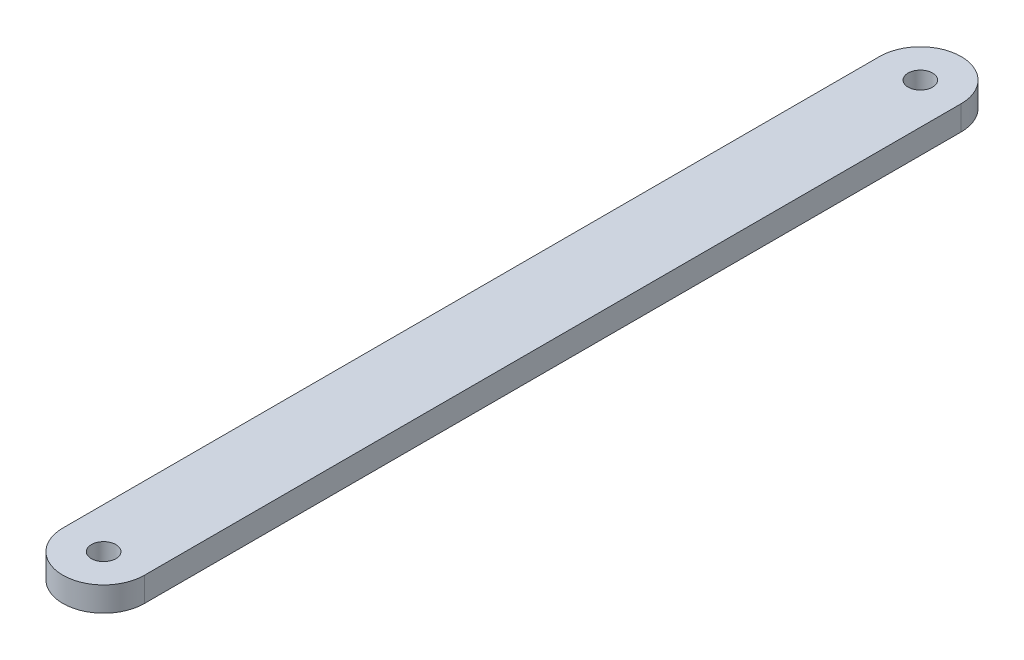
ISO-10303-21;
HEADER;
FILE_DESCRIPTION(('STEP AP214'),'2;1');
FILE_NAME('part.step','',(''),(''),'','','');
FILE_SCHEMA(('AUTOMOTIVE_DESIGN { 1 0 10303 214 1 1 1 1 }'));
ENDSEC;
DATA;
#1=APPLICATION_CONTEXT('core data for automotive mechanical design processes');
#2=APPLICATION_PROTOCOL_DEFINITION('international standard','automotive_design',2000,#1);
#3=PRODUCT_CONTEXT('',#1,'mechanical');
#4=PRODUCT('Part','Part','',(#3));
#5=PRODUCT_RELATED_PRODUCT_CATEGORY('part','',(#4));
#6=PRODUCT_DEFINITION_FORMATION('','',#4);
#7=PRODUCT_DEFINITION_CONTEXT('part definition',#1,'design');
#8=PRODUCT_DEFINITION('design','',#6,#7);
#9=PRODUCT_DEFINITION_SHAPE('','',#8);
#10=(LENGTH_UNIT() NAMED_UNIT(*) SI_UNIT(.MILLI.,.METRE.));
#11=(NAMED_UNIT(*) PLANE_ANGLE_UNIT() SI_UNIT($,.RADIAN.));
#12=(NAMED_UNIT(*) SI_UNIT($,.STERADIAN.) SOLID_ANGLE_UNIT());
#13=UNCERTAINTY_MEASURE_WITH_UNIT(LENGTH_MEASURE(1.E-05),#10,'distance_accuracy_value','');
#14=(GEOMETRIC_REPRESENTATION_CONTEXT(3) GLOBAL_UNCERTAINTY_ASSIGNED_CONTEXT((#13)) GLOBAL_UNIT_ASSIGNED_CONTEXT((#10,
#11,#12)) REPRESENTATION_CONTEXT('',''));
#15=CARTESIAN_POINT('',(0.,0.,0.));
#16=DIRECTION('',(0.,0.,1.));
#17=DIRECTION('',(1.,0.,0.));
#18=AXIS2_PLACEMENT_3D('',#15,#16,#17);
#19=CARTESIAN_POINT('',(-10.,0.499999999999999,-50.));
#20=DIRECTION('',(-1.,0.,0.));
#21=DIRECTION('',(0.,0.,1.));
#22=AXIS2_PLACEMENT_3D('',#19,#20,#21);
#23=PLANE('',#22);
#24=DIRECTION('',(0.,0.,1.));
#25=VECTOR('',#24,1.);
#26=CARTESIAN_POINT('',(-10.,-2.5,-50.));
#27=LINE('',#26,#25);
#28=CARTESIAN_POINT('',(-10.,-2.5,-50.));
#29=VERTEX_POINT('',#28);
#30=CARTESIAN_POINT('',(-10.,-2.5,50.));
#31=VERTEX_POINT('',#30);
#32=EDGE_CURVE('E51',#29,#31,#27,.T.);
#33=ORIENTED_EDGE('',*,*,#32,.T.);
#34=DIRECTION('',(0.,-1.,0.));
#35=VECTOR('',#34,1.);
#36=CARTESIAN_POINT('',(-10.,0.499999999999999,50.));
#37=LINE('',#36,#35);
#38=CARTESIAN_POINT('',(-10.,0.499999999999999,50.));
#39=VERTEX_POINT('',#38);
#40=EDGE_CURVE('E109',#39,#31,#37,.T.);
#41=ORIENTED_EDGE('',*,*,#40,.F.);
#42=DIRECTION('',(0.,0.,1.));
#43=VECTOR('',#42,1.);
#44=CARTESIAN_POINT('',(-10.,0.499999999999999,-50.));
#45=LINE('',#44,#43);
#46=CARTESIAN_POINT('',(-10.,0.5,-50.));
#47=VERTEX_POINT('',#46);
#48=EDGE_CURVE('E13',#47,#39,#45,.T.);
#49=ORIENTED_EDGE('',*,*,#48,.F.);
#50=DIRECTION('',(0.,-1.,0.));
#51=VECTOR('',#50,1.);
#52=CARTESIAN_POINT('',(-10.,0.499999999999999,-50.));
#53=LINE('',#52,#51);
#54=EDGE_CURVE('E91',#47,#29,#53,.T.);
#55=ORIENTED_EDGE('',*,*,#54,.T.);
#56=EDGE_LOOP('',(#33,#41,#49,#55));
#57=FACE_BOUND('',#56,.T.);
#58=ADVANCED_FACE('F48',(#57),#23,.T.);
#59=CARTESIAN_POINT('',(0.,0.5,-50.));
#60=DIRECTION('',(0.,1.,0.));
#61=DIRECTION('',(-1.,0.,0.));
#62=AXIS2_PLACEMENT_3D('',#59,#60,#61);
#63=PLANE('',#62);
#64=CARTESIAN_POINT('',(-5.,0.499999999999999,-50.));
#65=DIRECTION('',(0.,1.,0.));
#66=DIRECTION('',(-1.,0.,0.));
#67=AXIS2_PLACEMENT_3D('',#64,#65,#66);
#68=CIRCLE('',#67,1.5);
#69=CARTESIAN_POINT('',(-6.5,0.499999999999999,-50.));
#70=VERTEX_POINT('',#69);
#71=EDGE_CURVE('E127',#70,#70,#68,.T.);
#72=ORIENTED_EDGE('',*,*,#71,.F.);
#73=EDGE_LOOP('',(#72));
#74=FACE_BOUND('',#73,.T.);
#75=CARTESIAN_POINT('',(-5.,0.499999999999999,50.));
#76=DIRECTION('',(0.,1.,0.));
#77=DIRECTION('',(-1.,0.,0.));
#78=AXIS2_PLACEMENT_3D('',#75,#76,#77);
#79=CIRCLE('',#78,1.5);
#80=CARTESIAN_POINT('',(-6.5,0.499999999999999,50.));
#81=VERTEX_POINT('',#80);
#82=EDGE_CURVE('E121',#81,#81,#79,.F.);
#83=ORIENTED_EDGE('',*,*,#82,.T.);
#84=EDGE_LOOP('',(#83));
#85=FACE_BOUND('',#84,.T.);
#86=DIRECTION('',(0.,0.,1.));
#87=VECTOR('',#86,1.);
#88=CARTESIAN_POINT('',(0.,0.5,-50.));
#89=LINE('',#88,#87);
#90=CARTESIAN_POINT('',(0.,0.5,-50.));
#91=VERTEX_POINT('',#90);
#92=CARTESIAN_POINT('',(0.,0.5,50.));
#93=VERTEX_POINT('',#92);
#94=EDGE_CURVE('E56',#91,#93,#89,.T.);
#95=ORIENTED_EDGE('',*,*,#94,.F.);
#96=CARTESIAN_POINT('',(-5.,0.5,-50.));
#97=DIRECTION('',(0.,-1.,0.));
#98=DIRECTION('',(0.,0.,-1.));
#99=AXIS2_PLACEMENT_3D('',#96,#97,#98);
#100=CIRCLE('',#99,5.);
#101=EDGE_CURVE('E96',#47,#91,#100,.T.);
#102=ORIENTED_EDGE('',*,*,#101,.F.);
#103=ORIENTED_EDGE('',*,*,#48,.T.);
#104=CARTESIAN_POINT('',(-5.,0.5,50.));
#105=DIRECTION('',(0.,1.,0.));
#106=DIRECTION('',(0.,0.,1.));
#107=AXIS2_PLACEMENT_3D('',#104,#105,#106);
#108=CIRCLE('',#107,5.);
#109=EDGE_CURVE('E95',#39,#93,#108,.T.);
#110=ORIENTED_EDGE('',*,*,#109,.T.);
#111=EDGE_LOOP('',(#95,#102,#103,#110));
#112=FACE_BOUND('',#111,.T.);
#113=ADVANCED_FACE('F143',(#74,#85,#112),#63,.T.);
#114=CARTESIAN_POINT('',(0.,0.5,-50.));
#115=DIRECTION('',(1.,0.,0.));
#116=DIRECTION('',(0.,1.,0.));
#117=AXIS2_PLACEMENT_3D('',#114,#115,#116);
#118=PLANE('',#117);
#119=ORIENTED_EDGE('',*,*,#94,.T.);
#120=DIRECTION('',(0.,1.,0.));
#121=VECTOR('',#120,1.);
#122=CARTESIAN_POINT('',(0.,0.5,50.));
#123=LINE('',#122,#121);
#124=CARTESIAN_POINT('',(0.,-2.5,50.));
#125=VERTEX_POINT('',#124);
#126=EDGE_CURVE('E105',#125,#93,#123,.T.);
#127=ORIENTED_EDGE('',*,*,#126,.F.);
#128=DIRECTION('',(0.,0.,1.));
#129=VECTOR('',#128,1.);
#130=CARTESIAN_POINT('',(0.,-2.5,-50.));
#131=LINE('',#130,#129);
#132=CARTESIAN_POINT('',(0.,-2.5,-50.));
#133=VERTEX_POINT('',#132);
#134=EDGE_CURVE('E104',#133,#125,#131,.T.);
#135=ORIENTED_EDGE('',*,*,#134,.F.);
#136=DIRECTION('',(0.,1.,0.));
#137=VECTOR('',#136,1.);
#138=CARTESIAN_POINT('',(0.,0.5,-50.));
#139=LINE('',#138,#137);
#140=EDGE_CURVE('E93',#133,#91,#139,.T.);
#141=ORIENTED_EDGE('',*,*,#140,.T.);
#142=EDGE_LOOP('',(#119,#127,#135,#141));
#143=FACE_BOUND('',#142,.T.);
#144=ADVANCED_FACE('F146',(#143),#118,.T.);
#145=CARTESIAN_POINT('',(0.,-2.5,-50.));
#146=DIRECTION('',(0.,-1.,0.));
#147=DIRECTION('',(1.,0.,0.));
#148=AXIS2_PLACEMENT_3D('',#145,#146,#147);
#149=PLANE('',#148);
#150=CARTESIAN_POINT('',(-5.,-2.5,-50.));
#151=DIRECTION('',(0.,1.,0.));
#152=DIRECTION('',(1.,0.,0.));
#153=AXIS2_PLACEMENT_3D('',#150,#151,#152);
#154=CIRCLE('',#153,1.5);
#155=CARTESIAN_POINT('',(-3.5,-2.5,-50.));
#156=VERTEX_POINT('',#155);
#157=EDGE_CURVE('E130',#156,#156,#154,.T.);
#158=ORIENTED_EDGE('',*,*,#157,.T.);
#159=EDGE_LOOP('',(#158));
#160=FACE_BOUND('',#159,.T.);
#161=CARTESIAN_POINT('',(-5.,-2.5,50.));
#162=DIRECTION('',(0.,-1.,0.));
#163=DIRECTION('',(1.,0.,0.));
#164=AXIS2_PLACEMENT_3D('',#161,#162,#163);
#165=CIRCLE('',#164,1.5);
#166=CARTESIAN_POINT('',(-3.5,-2.5,50.));
#167=VERTEX_POINT('',#166);
#168=EDGE_CURVE('E124',#167,#167,#165,.T.);
#169=ORIENTED_EDGE('',*,*,#168,.F.);
#170=EDGE_LOOP('',(#169));
#171=FACE_BOUND('',#170,.T.);
#172=ORIENTED_EDGE('',*,*,#32,.F.);
#173=CARTESIAN_POINT('',(-5.,-2.5,-50.));
#174=DIRECTION('',(0.,-1.,0.));
#175=DIRECTION('',(0.,0.,-1.));
#176=AXIS2_PLACEMENT_3D('',#173,#174,#175);
#177=CIRCLE('',#176,5.);
#178=EDGE_CURVE('E64',#29,#133,#177,.T.);
#179=ORIENTED_EDGE('',*,*,#178,.T.);
#180=ORIENTED_EDGE('',*,*,#134,.T.);
#181=CARTESIAN_POINT('',(-5.,-2.5,50.));
#182=DIRECTION('',(0.,1.,0.));
#183=DIRECTION('',(0.,0.,1.));
#184=AXIS2_PLACEMENT_3D('',#181,#182,#183);
#185=CIRCLE('',#184,5.);
#186=EDGE_CURVE('E101',#31,#125,#185,.T.);
#187=ORIENTED_EDGE('',*,*,#186,.F.);
#188=EDGE_LOOP('',(#172,#179,#180,#187));
#189=FACE_BOUND('',#188,.T.);
#190=ADVANCED_FACE('F99',(#160,#171,#189),#149,.T.);
#191=CARTESIAN_POINT('',(-5.,0.5,50.));
#192=DIRECTION('',(0.,1.,0.));
#193=DIRECTION('',(0.,0.,1.));
#194=AXIS2_PLACEMENT_3D('',#191,#192,#193);
#195=CYLINDRICAL_SURFACE('',#194,5.);
#196=ORIENTED_EDGE('',*,*,#40,.T.);
#197=ORIENTED_EDGE('',*,*,#186,.T.);
#198=ORIENTED_EDGE('',*,*,#126,.T.);
#199=ORIENTED_EDGE('',*,*,#109,.F.);
#200=EDGE_LOOP('',(#196,#197,#198,#199));
#201=FACE_BOUND('',#200,.T.);
#202=ADVANCED_FACE('F115',(#201),#195,.T.);
#203=CARTESIAN_POINT('',(-5.,0.5,-50.));
#204=DIRECTION('',(0.,1.,0.));
#205=DIRECTION('',(0.,0.,-1.));
#206=AXIS2_PLACEMENT_3D('',#203,#204,#205);
#207=CYLINDRICAL_SURFACE('',#206,5.);
#208=ORIENTED_EDGE('',*,*,#178,.F.);
#209=ORIENTED_EDGE('',*,*,#54,.F.);
#210=ORIENTED_EDGE('',*,*,#101,.T.);
#211=ORIENTED_EDGE('',*,*,#140,.F.);
#212=EDGE_LOOP('',(#208,#209,#210,#211));
#213=FACE_BOUND('',#212,.T.);
#214=ADVANCED_FACE('F89',(#213),#207,.T.);
#215=CARTESIAN_POINT('',(-5.,4.74264068711929,50.));
#216=DIRECTION('',(0.,-1.,0.));
#217=DIRECTION('',(1.,0.,0.));
#218=AXIS2_PLACEMENT_3D('',#215,#216,#217);
#219=CYLINDRICAL_SURFACE('',#218,1.5);
#220=ORIENTED_EDGE('',*,*,#168,.T.);
#221=EDGE_LOOP('',(#220));
#222=FACE_BOUND('',#221,.T.);
#223=ORIENTED_EDGE('',*,*,#82,.F.);
#224=EDGE_LOOP('',(#223));
#225=FACE_BOUND('',#224,.T.);
#226=ADVANCED_FACE('F139',(#222,#225),#219,.F.);
#227=CARTESIAN_POINT('',(-5.,4.74264068711929,-50.));
#228=DIRECTION('',(0.,-1.,0.));
#229=DIRECTION('',(1.,0.,0.));
#230=AXIS2_PLACEMENT_3D('',#227,#228,#229);
#231=CYLINDRICAL_SURFACE('',#230,1.5);
#232=ORIENTED_EDGE('',*,*,#157,.F.);
#233=EDGE_LOOP('',(#232));
#234=FACE_BOUND('',#233,.T.);
#235=ORIENTED_EDGE('',*,*,#71,.T.);
#236=EDGE_LOOP('',(#235));
#237=FACE_BOUND('',#236,.T.);
#238=ADVANCED_FACE('F136',(#234,#237),#231,.F.);
#239=CLOSED_SHELL('',(#58,#113,#144,#190,#202,#214,#226,#238));
#240=MANIFOLD_SOLID_BREP('B2',#239);
#241=ADVANCED_BREP_SHAPE_REPRESENTATION('',(#18,#240),#14);
#242=SHAPE_DEFINITION_REPRESENTATION(#9,#241);
ENDSEC;
END-ISO-10303-21;
